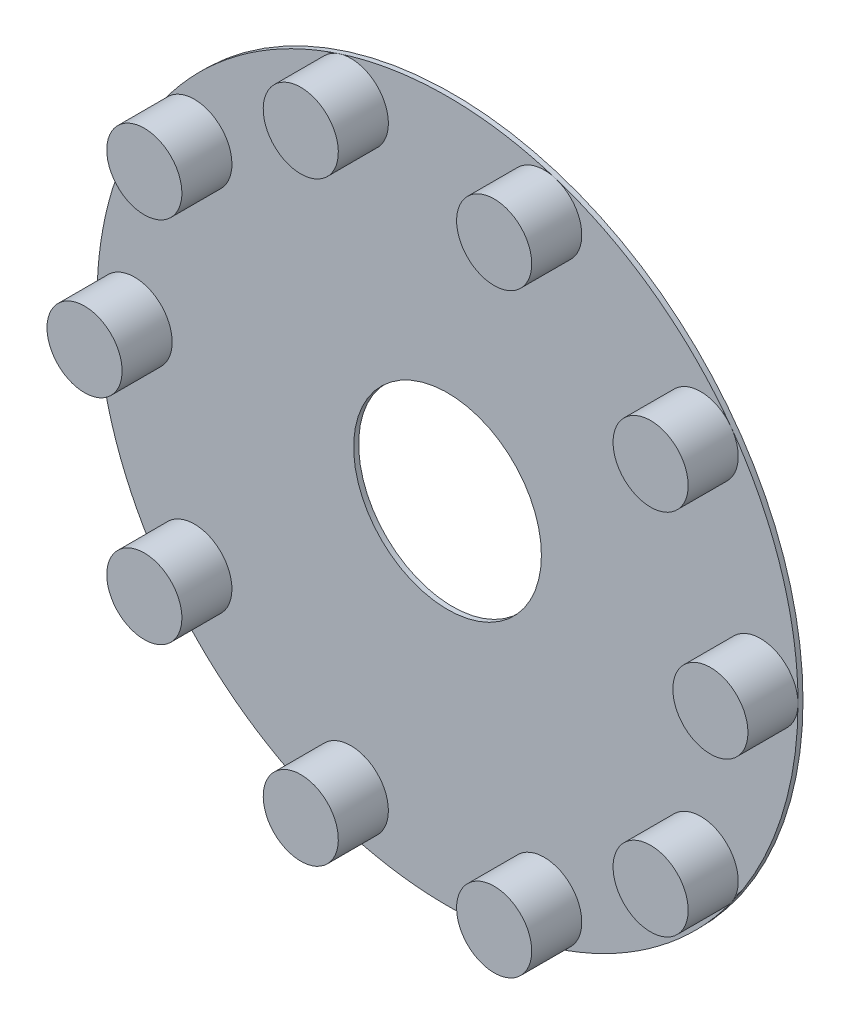
ISO-10303-21;
HEADER;
FILE_DESCRIPTION(('STEP AP214'),'2;1');
FILE_NAME('part.step','',(''),(''),'','','');
FILE_SCHEMA(('AUTOMOTIVE_DESIGN { 1 0 10303 214 1 1 1 1 }'));
ENDSEC;
DATA;
#1=APPLICATION_CONTEXT('core data for automotive mechanical design processes');
#2=APPLICATION_PROTOCOL_DEFINITION('international standard','automotive_design',2000,#1);
#3=PRODUCT_CONTEXT('',#1,'mechanical');
#4=PRODUCT('Part','Part','',(#3));
#5=PRODUCT_RELATED_PRODUCT_CATEGORY('part','',(#4));
#6=PRODUCT_DEFINITION_FORMATION('','',#4);
#7=PRODUCT_DEFINITION_CONTEXT('part definition',#1,'design');
#8=PRODUCT_DEFINITION('design','',#6,#7);
#9=PRODUCT_DEFINITION_SHAPE('','',#8);
#10=(LENGTH_UNIT() NAMED_UNIT(*) SI_UNIT(.MILLI.,.METRE.));
#11=(NAMED_UNIT(*) PLANE_ANGLE_UNIT() SI_UNIT($,.RADIAN.));
#12=(NAMED_UNIT(*) SI_UNIT($,.STERADIAN.) SOLID_ANGLE_UNIT());
#13=UNCERTAINTY_MEASURE_WITH_UNIT(LENGTH_MEASURE(1.E-05),#10,'distance_accuracy_value','');
#14=(GEOMETRIC_REPRESENTATION_CONTEXT(3) GLOBAL_UNCERTAINTY_ASSIGNED_CONTEXT((#13)) GLOBAL_UNIT_ASSIGNED_CONTEXT((#10,
#11,#12)) REPRESENTATION_CONTEXT('',''));
#15=CARTESIAN_POINT('',(0.,0.,0.));
#16=DIRECTION('',(0.,0.,1.));
#17=DIRECTION('',(1.,0.,0.));
#18=AXIS2_PLACEMENT_3D('',#15,#16,#17);
#19=CARTESIAN_POINT('',(0.,0.,-0.2));
#20=DIRECTION('',(0.,0.,1.));
#21=DIRECTION('',(1.,0.,0.));
#22=AXIS2_PLACEMENT_3D('',#19,#20,#21);
#23=CYLINDRICAL_SURFACE('',#22,28.);
#24=CARTESIAN_POINT('',(0.,0.,0.2));
#25=DIRECTION('',(0.,0.,1.));
#26=DIRECTION('',(1.,0.,0.));
#27=AXIS2_PLACEMENT_3D('',#24,#25,#26);
#28=CIRCLE('',#27,28.);
#29=CARTESIAN_POINT('',(28.,0.,0.2));
#30=VERTEX_POINT('',#29);
#31=CARTESIAN_POINT('',(22.6524758424985,16.4579870641893,0.2));
#32=VERTEX_POINT('',#31);
#33=EDGE_CURVE('E66',#30,#32,#28,.T.);
#34=ORIENTED_EDGE('',*,*,#33,.F.);
#35=CARTESIAN_POINT('',(22.6524758424985,-16.4579870641892,0.2));
#36=VERTEX_POINT('',#35);
#37=EDGE_CURVE('E62',#36,#30,#28,.T.);
#38=ORIENTED_EDGE('',*,*,#37,.F.);
#39=CARTESIAN_POINT('',(8.65247584249853,-26.6295824562643,0.2));
#40=VERTEX_POINT('',#39);
#41=EDGE_CURVE('E91',#40,#36,#28,.T.);
#42=ORIENTED_EDGE('',*,*,#41,.F.);
#43=CARTESIAN_POINT('',(-8.65247584249853,-26.6295824562643,0.2));
#44=VERTEX_POINT('',#43);
#45=EDGE_CURVE('E105',#44,#40,#28,.T.);
#46=ORIENTED_EDGE('',*,*,#45,.F.);
#47=CARTESIAN_POINT('',(-22.6524758424985,-16.4579870641893,0.2));
#48=VERTEX_POINT('',#47);
#49=EDGE_CURVE('E134',#48,#44,#28,.T.);
#50=ORIENTED_EDGE('',*,*,#49,.F.);
#51=CARTESIAN_POINT('',(-28.,0.,0.2));
#52=VERTEX_POINT('',#51);
#53=EDGE_CURVE('E129',#52,#48,#28,.T.);
#54=ORIENTED_EDGE('',*,*,#53,.F.);
#55=CARTESIAN_POINT('',(-22.6524758424985,16.4579870641892,0.2));
#56=VERTEX_POINT('',#55);
#57=EDGE_CURVE('E124',#56,#52,#28,.T.);
#58=ORIENTED_EDGE('',*,*,#57,.F.);
#59=CARTESIAN_POINT('',(-8.65247584249853,26.6295824562643,0.2));
#60=VERTEX_POINT('',#59);
#61=EDGE_CURVE('E121',#60,#56,#28,.T.);
#62=ORIENTED_EDGE('',*,*,#61,.F.);
#63=CARTESIAN_POINT('',(8.65247584249852,26.6295824562643,0.2));
#64=VERTEX_POINT('',#63);
#65=EDGE_CURVE('E120',#64,#60,#28,.T.);
#66=ORIENTED_EDGE('',*,*,#65,.F.);
#67=EDGE_CURVE('E114',#32,#64,#28,.T.);
#68=ORIENTED_EDGE('',*,*,#67,.F.);
#69=EDGE_LOOP('',(#34,#38,#42,#46,#50,#54,#58,#62,#66,#68));
#70=FACE_BOUND('',#69,.T.);
#71=CARTESIAN_POINT('',(0.,0.,-0.2));
#72=DIRECTION('',(0.,0.,1.));
#73=DIRECTION('',(1.,0.,0.));
#74=AXIS2_PLACEMENT_3D('',#71,#72,#73);
#75=CIRCLE('',#74,28.);
#76=CARTESIAN_POINT('',(28.,0.,-0.2));
#77=VERTEX_POINT('',#76);
#78=EDGE_CURVE('E53',#77,#77,#75,.T.);
#79=ORIENTED_EDGE('',*,*,#78,.T.);
#80=EDGE_LOOP('',(#79));
#81=FACE_BOUND('',#80,.T.);
#82=ADVANCED_FACE('F44',(#70,#81),#23,.T.);
#83=CARTESIAN_POINT('',(0.,0.,-0.2));
#84=DIRECTION('',(0.,0.,1.));
#85=DIRECTION('',(1.,0.,0.));
#86=AXIS2_PLACEMENT_3D('',#83,#84,#85);
#87=PLANE('',#86);
#88=CARTESIAN_POINT('',(0.,0.,-0.2));
#89=DIRECTION('',(0.,0.,1.));
#90=DIRECTION('',(1.,0.,0.));
#91=AXIS2_PLACEMENT_3D('',#88,#89,#90);
#92=CIRCLE('',#91,7.5);
#93=CARTESIAN_POINT('',(7.5,0.,-0.2));
#94=VERTEX_POINT('',#93);
#95=EDGE_CURVE('E191',#94,#94,#92,.F.);
#96=ORIENTED_EDGE('',*,*,#95,.F.);
#97=EDGE_LOOP('',(#96));
#98=FACE_BOUND('',#97,.T.);
#99=ORIENTED_EDGE('',*,*,#78,.F.);
#100=EDGE_LOOP('',(#99));
#101=FACE_BOUND('',#100,.T.);
#102=ADVANCED_FACE('F218',(#98,#101),#87,.F.);
#103=CARTESIAN_POINT('',(0.,0.,0.2));
#104=DIRECTION('',(0.,0.,1.));
#105=DIRECTION('',(1.,0.,0.));
#106=AXIS2_PLACEMENT_3D('',#103,#104,#105);
#107=PLANE('',#106);
#108=CARTESIAN_POINT('',(0.,0.,0.2));
#109=DIRECTION('',(0.,0.,1.));
#110=DIRECTION('',(1.,0.,0.));
#111=AXIS2_PLACEMENT_3D('',#108,#109,#110);
#112=CIRCLE('',#111,7.5);
#113=CARTESIAN_POINT('',(7.5,0.,0.2));
#114=VERTEX_POINT('',#113);
#115=EDGE_CURVE('E48',#114,#114,#112,.F.);
#116=ORIENTED_EDGE('',*,*,#115,.T.);
#117=EDGE_LOOP('',(#116));
#118=FACE_BOUND('',#117,.T.);
#119=ORIENTED_EDGE('',*,*,#33,.T.);
#120=CARTESIAN_POINT('',(20.2254248593737,14.6946313073118,0.2));
#121=DIRECTION('',(0.,0.,1.));
#122=DIRECTION('',(0.809016994374947,0.587785252292473,0.));
#123=AXIS2_PLACEMENT_3D('',#120,#121,#122);
#124=CIRCLE('',#123,3.);
#125=EDGE_CURVE('E190',#32,#32,#124,.T.);
#126=ORIENTED_EDGE('',*,*,#125,.F.);
#127=ORIENTED_EDGE('',*,*,#67,.T.);
#128=CARTESIAN_POINT('',(7.72542485937368,23.7764129073788,0.2));
#129=DIRECTION('',(0.,0.,1.));
#130=DIRECTION('',(0.309016994374947,0.951056516295154,0.));
#131=AXIS2_PLACEMENT_3D('',#128,#129,#130);
#132=CIRCLE('',#131,3.);
#133=EDGE_CURVE('E178',#64,#64,#132,.T.);
#134=ORIENTED_EDGE('',*,*,#133,.F.);
#135=ORIENTED_EDGE('',*,*,#65,.T.);
#136=CARTESIAN_POINT('',(-7.72542485937369,23.7764129073788,0.2));
#137=DIRECTION('',(0.,0.,1.));
#138=DIRECTION('',(-0.309016994374948,0.951056516295154,0.));
#139=AXIS2_PLACEMENT_3D('',#136,#137,#138);
#140=CIRCLE('',#139,3.);
#141=EDGE_CURVE('E172',#60,#60,#140,.T.);
#142=ORIENTED_EDGE('',*,*,#141,.F.);
#143=ORIENTED_EDGE('',*,*,#61,.T.);
#144=CARTESIAN_POINT('',(-20.2254248593737,14.6946313073118,0.2));
#145=DIRECTION('',(0.,0.,1.));
#146=DIRECTION('',(-0.809016994374948,0.587785252292473,0.));
#147=AXIS2_PLACEMENT_3D('',#144,#145,#146);
#148=CIRCLE('',#147,3.);
#149=EDGE_CURVE('E162',#56,#56,#148,.T.);
#150=ORIENTED_EDGE('',*,*,#149,.F.);
#151=ORIENTED_EDGE('',*,*,#57,.T.);
#152=CARTESIAN_POINT('',(-25.,0.,0.2));
#153=DIRECTION('',(0.,0.,1.));
#154=DIRECTION('',(-1.,0.,0.));
#155=AXIS2_PLACEMENT_3D('',#152,#153,#154);
#156=CIRCLE('',#155,3.);
#157=EDGE_CURVE('E153',#52,#52,#156,.T.);
#158=ORIENTED_EDGE('',*,*,#157,.F.);
#159=ORIENTED_EDGE('',*,*,#53,.T.);
#160=CARTESIAN_POINT('',(-20.2254248593737,-14.6946313073118,0.2));
#161=DIRECTION('',(0.,0.,1.));
#162=DIRECTION('',(-0.809016994374947,-0.587785252292473,0.));
#163=AXIS2_PLACEMENT_3D('',#160,#161,#162);
#164=CIRCLE('',#163,3.);
#165=EDGE_CURVE('E142',#48,#48,#164,.T.);
#166=ORIENTED_EDGE('',*,*,#165,.F.);
#167=ORIENTED_EDGE('',*,*,#49,.T.);
#168=CARTESIAN_POINT('',(-7.72542485937368,-23.7764129073788,0.2));
#169=DIRECTION('',(0.,0.,1.));
#170=DIRECTION('',(-0.309016994374947,-0.951056516295154,0.));
#171=AXIS2_PLACEMENT_3D('',#168,#169,#170);
#172=CIRCLE('',#171,3.);
#173=EDGE_CURVE('E139',#44,#44,#172,.T.);
#174=ORIENTED_EDGE('',*,*,#173,.F.);
#175=ORIENTED_EDGE('',*,*,#45,.T.);
#176=CARTESIAN_POINT('',(7.72542485937369,-23.7764129073788,0.2));
#177=DIRECTION('',(0.,0.,1.));
#178=DIRECTION('',(0.309016994374948,-0.951056516295154,0.));
#179=AXIS2_PLACEMENT_3D('',#176,#177,#178);
#180=CIRCLE('',#179,3.);
#181=EDGE_CURVE('E98',#40,#40,#180,.T.);
#182=ORIENTED_EDGE('',*,*,#181,.F.);
#183=ORIENTED_EDGE('',*,*,#41,.T.);
#184=CARTESIAN_POINT('',(20.2254248593737,-14.6946313073118,0.2));
#185=DIRECTION('',(0.,0.,1.));
#186=DIRECTION('',(0.809016994374947,-0.587785252292473,0.));
#187=AXIS2_PLACEMENT_3D('',#184,#185,#186);
#188=CIRCLE('',#187,3.);
#189=EDGE_CURVE('E96',#36,#36,#188,.T.);
#190=ORIENTED_EDGE('',*,*,#189,.F.);
#191=ORIENTED_EDGE('',*,*,#37,.T.);
#192=CARTESIAN_POINT('',(25.,0.,0.2));
#193=DIRECTION('',(0.,0.,1.));
#194=DIRECTION('',(1.,0.,0.));
#195=AXIS2_PLACEMENT_3D('',#192,#193,#194);
#196=CIRCLE('',#195,3.);
#197=EDGE_CURVE('E11',#30,#30,#196,.T.);
#198=ORIENTED_EDGE('',*,*,#197,.F.);
#199=EDGE_LOOP('',(#119,#126,#127,#134,#135,#142,#143,#150,#151,#158,#159,#166,#167,#174,#175,
#182,#183,#190,#191,#198));
#200=FACE_BOUND('',#199,.T.);
#201=ADVANCED_FACE('F94',(#118,#200),#107,.T.);
#202=CARTESIAN_POINT('',(25.,0.,-0.2));
#203=DIRECTION('',(0.,0.,1.));
#204=DIRECTION('',(1.,0.,0.));
#205=AXIS2_PLACEMENT_3D('',#202,#203,#204);
#206=CYLINDRICAL_SURFACE('',#205,3.);
#207=ORIENTED_EDGE('',*,*,#197,.T.);
#208=EDGE_LOOP('',(#207));
#209=FACE_BOUND('',#208,.T.);
#210=CARTESIAN_POINT('',(25.,0.,4.2));
#211=DIRECTION('',(0.,0.,1.));
#212=DIRECTION('',(1.,0.,0.));
#213=AXIS2_PLACEMENT_3D('',#210,#211,#212);
#214=CIRCLE('',#213,3.);
#215=CARTESIAN_POINT('',(28.,0.,4.2));
#216=VERTEX_POINT('',#215);
#217=EDGE_CURVE('E106',#216,#216,#214,.T.);
#218=ORIENTED_EDGE('',*,*,#217,.F.);
#219=EDGE_LOOP('',(#218));
#220=FACE_BOUND('',#219,.T.);
#221=ADVANCED_FACE('F216',(#209,#220),#206,.T.);
#222=CARTESIAN_POINT('',(25.,0.,4.2));
#223=DIRECTION('',(0.,0.,1.));
#224=DIRECTION('',(1.,0.,0.));
#225=AXIS2_PLACEMENT_3D('',#222,#223,#224);
#226=PLANE('',#225);
#227=ORIENTED_EDGE('',*,*,#217,.T.);
#228=EDGE_LOOP('',(#227));
#229=FACE_BOUND('',#228,.T.);
#230=ADVANCED_FACE('F206',(#229),#226,.T.);
#231=CARTESIAN_POINT('',(20.2254248593737,-14.6946313073118,-0.2));
#232=DIRECTION('',(0.,0.,1.));
#233=DIRECTION('',(0.809016994374947,-0.587785252292473,0.));
#234=AXIS2_PLACEMENT_3D('',#231,#232,#233);
#235=CYLINDRICAL_SURFACE('',#234,3.);
#236=ORIENTED_EDGE('',*,*,#189,.T.);
#237=EDGE_LOOP('',(#236));
#238=FACE_BOUND('',#237,.T.);
#239=CARTESIAN_POINT('',(20.2254248593737,-14.6946313073118,4.2));
#240=DIRECTION('',(0.,0.,1.));
#241=DIRECTION('',(0.809016994374947,-0.587785252292473,0.));
#242=AXIS2_PLACEMENT_3D('',#239,#240,#241);
#243=CIRCLE('',#242,3.);
#244=CARTESIAN_POINT('',(22.6524758424985,-16.4579870641892,4.2));
#245=VERTEX_POINT('',#244);
#246=EDGE_CURVE('E108',#245,#245,#243,.T.);
#247=ORIENTED_EDGE('',*,*,#246,.F.);
#248=EDGE_LOOP('',(#247));
#249=FACE_BOUND('',#248,.T.);
#250=ADVANCED_FACE('F204',(#238,#249),#235,.T.);
#251=CARTESIAN_POINT('',(20.2254248593737,-14.6946313073118,4.2));
#252=DIRECTION('',(0.,0.,1.));
#253=DIRECTION('',(0.809016994374947,-0.587785252292473,0.));
#254=AXIS2_PLACEMENT_3D('',#251,#252,#253);
#255=PLANE('',#254);
#256=ORIENTED_EDGE('',*,*,#246,.T.);
#257=EDGE_LOOP('',(#256));
#258=FACE_BOUND('',#257,.T.);
#259=ADVANCED_FACE('F205',(#258),#255,.T.);
#260=CARTESIAN_POINT('',(7.72542485937369,-23.7764129073788,-0.2));
#261=DIRECTION('',(0.,0.,1.));
#262=DIRECTION('',(0.309016994374948,-0.951056516295154,0.));
#263=AXIS2_PLACEMENT_3D('',#260,#261,#262);
#264=CYLINDRICAL_SURFACE('',#263,3.);
#265=ORIENTED_EDGE('',*,*,#181,.T.);
#266=EDGE_LOOP('',(#265));
#267=FACE_BOUND('',#266,.T.);
#268=CARTESIAN_POINT('',(7.72542485937369,-23.7764129073788,4.2));
#269=DIRECTION('',(0.,0.,1.));
#270=DIRECTION('',(0.309016994374948,-0.951056516295154,0.));
#271=AXIS2_PLACEMENT_3D('',#268,#269,#270);
#272=CIRCLE('',#271,3.);
#273=CARTESIAN_POINT('',(8.65247584249853,-26.6295824562643,4.2));
#274=VERTEX_POINT('',#273);
#275=EDGE_CURVE('E197',#274,#274,#272,.T.);
#276=ORIENTED_EDGE('',*,*,#275,.F.);
#277=EDGE_LOOP('',(#276));
#278=FACE_BOUND('',#277,.T.);
#279=ADVANCED_FACE('F213',(#267,#278),#264,.T.);
#280=CARTESIAN_POINT('',(7.72542485937369,-23.7764129073788,4.2));
#281=DIRECTION('',(0.,0.,1.));
#282=DIRECTION('',(0.309016994374948,-0.951056516295154,0.));
#283=AXIS2_PLACEMENT_3D('',#280,#281,#282);
#284=PLANE('',#283);
#285=ORIENTED_EDGE('',*,*,#275,.T.);
#286=EDGE_LOOP('',(#285));
#287=FACE_BOUND('',#286,.T.);
#288=ADVANCED_FACE('F268',(#287),#284,.T.);
#289=CARTESIAN_POINT('',(-7.72542485937368,-23.7764129073788,-0.2));
#290=DIRECTION('',(0.,0.,1.));
#291=DIRECTION('',(-0.309016994374947,-0.951056516295154,0.));
#292=AXIS2_PLACEMENT_3D('',#289,#290,#291);
#293=CYLINDRICAL_SURFACE('',#292,3.);
#294=ORIENTED_EDGE('',*,*,#173,.T.);
#295=EDGE_LOOP('',(#294));
#296=FACE_BOUND('',#295,.T.);
#297=CARTESIAN_POINT('',(-7.72542485937368,-23.7764129073788,4.2));
#298=DIRECTION('',(0.,0.,1.));
#299=DIRECTION('',(-0.309016994374947,-0.951056516295154,0.));
#300=AXIS2_PLACEMENT_3D('',#297,#298,#299);
#301=CIRCLE('',#300,3.);
#302=CARTESIAN_POINT('',(-8.65247584249853,-26.6295824562643,4.2));
#303=VERTEX_POINT('',#302);
#304=EDGE_CURVE('E156',#303,#303,#301,.T.);
#305=ORIENTED_EDGE('',*,*,#304,.F.);
#306=EDGE_LOOP('',(#305));
#307=FACE_BOUND('',#306,.T.);
#308=ADVANCED_FACE('F279',(#296,#307),#293,.T.);
#309=CARTESIAN_POINT('',(-7.72542485937368,-23.7764129073788,4.2));
#310=DIRECTION('',(0.,0.,1.));
#311=DIRECTION('',(-0.309016994374947,-0.951056516295154,0.));
#312=AXIS2_PLACEMENT_3D('',#309,#310,#311);
#313=PLANE('',#312);
#314=ORIENTED_EDGE('',*,*,#304,.T.);
#315=EDGE_LOOP('',(#314));
#316=FACE_BOUND('',#315,.T.);
#317=ADVANCED_FACE('F287',(#316),#313,.T.);
#318=CARTESIAN_POINT('',(-20.2254248593737,-14.6946313073118,-0.2));
#319=DIRECTION('',(0.,0.,1.));
#320=DIRECTION('',(-0.809016994374947,-0.587785252292473,0.));
#321=AXIS2_PLACEMENT_3D('',#318,#319,#320);
#322=CYLINDRICAL_SURFACE('',#321,3.);
#323=ORIENTED_EDGE('',*,*,#165,.T.);
#324=EDGE_LOOP('',(#323));
#325=FACE_BOUND('',#324,.T.);
#326=CARTESIAN_POINT('',(-20.2254248593737,-14.6946313073118,4.2));
#327=DIRECTION('',(0.,0.,1.));
#328=DIRECTION('',(-0.809016994374947,-0.587785252292473,0.));
#329=AXIS2_PLACEMENT_3D('',#326,#327,#328);
#330=CIRCLE('',#329,3.);
#331=CARTESIAN_POINT('',(-22.6524758424985,-16.4579870641893,4.2));
#332=VERTEX_POINT('',#331);
#333=EDGE_CURVE('E144',#332,#332,#330,.T.);
#334=ORIENTED_EDGE('',*,*,#333,.F.);
#335=EDGE_LOOP('',(#334));
#336=FACE_BOUND('',#335,.T.);
#337=ADVANCED_FACE('F299',(#325,#336),#322,.T.);
#338=CARTESIAN_POINT('',(-20.2254248593737,-14.6946313073118,4.2));
#339=DIRECTION('',(0.,0.,1.));
#340=DIRECTION('',(-0.809016994374947,-0.587785252292473,0.));
#341=AXIS2_PLACEMENT_3D('',#338,#339,#340);
#342=PLANE('',#341);
#343=ORIENTED_EDGE('',*,*,#333,.T.);
#344=EDGE_LOOP('',(#343));
#345=FACE_BOUND('',#344,.T.);
#346=ADVANCED_FACE('F306',(#345),#342,.T.);
#347=CARTESIAN_POINT('',(-25.,0.,-0.2));
#348=DIRECTION('',(0.,0.,1.));
#349=DIRECTION('',(-1.,0.,0.));
#350=AXIS2_PLACEMENT_3D('',#347,#348,#349);
#351=CYLINDRICAL_SURFACE('',#350,3.);
#352=ORIENTED_EDGE('',*,*,#157,.T.);
#353=EDGE_LOOP('',(#352));
#354=FACE_BOUND('',#353,.T.);
#355=CARTESIAN_POINT('',(-25.,0.,4.2));
#356=DIRECTION('',(0.,0.,1.));
#357=DIRECTION('',(-1.,0.,0.));
#358=AXIS2_PLACEMENT_3D('',#355,#356,#357);
#359=CIRCLE('',#358,3.);
#360=CARTESIAN_POINT('',(-28.,0.,4.2));
#361=VERTEX_POINT('',#360);
#362=EDGE_CURVE('E148',#361,#361,#359,.T.);
#363=ORIENTED_EDGE('',*,*,#362,.F.);
#364=EDGE_LOOP('',(#363));
#365=FACE_BOUND('',#364,.T.);
#366=ADVANCED_FACE('F320',(#354,#365),#351,.T.);
#367=CARTESIAN_POINT('',(-25.,0.,4.2));
#368=DIRECTION('',(0.,0.,1.));
#369=DIRECTION('',(-1.,0.,0.));
#370=AXIS2_PLACEMENT_3D('',#367,#368,#369);
#371=PLANE('',#370);
#372=ORIENTED_EDGE('',*,*,#362,.T.);
#373=EDGE_LOOP('',(#372));
#374=FACE_BOUND('',#373,.T.);
#375=ADVANCED_FACE('F330',(#374),#371,.T.);
#376=CARTESIAN_POINT('',(-20.2254248593737,14.6946313073118,-0.2));
#377=DIRECTION('',(0.,0.,1.));
#378=DIRECTION('',(-0.809016994374948,0.587785252292473,0.));
#379=AXIS2_PLACEMENT_3D('',#376,#377,#378);
#380=CYLINDRICAL_SURFACE('',#379,3.);
#381=ORIENTED_EDGE('',*,*,#149,.T.);
#382=EDGE_LOOP('',(#381));
#383=FACE_BOUND('',#382,.T.);
#384=CARTESIAN_POINT('',(-20.2254248593737,14.6946313073118,4.2));
#385=DIRECTION('',(0.,0.,1.));
#386=DIRECTION('',(-0.809016994374948,0.587785252292473,0.));
#387=AXIS2_PLACEMENT_3D('',#384,#385,#386);
#388=CIRCLE('',#387,3.);
#389=CARTESIAN_POINT('',(-22.6524758424985,16.4579870641892,4.2));
#390=VERTEX_POINT('',#389);
#391=EDGE_CURVE('E161',#390,#390,#388,.T.);
#392=ORIENTED_EDGE('',*,*,#391,.F.);
#393=EDGE_LOOP('',(#392));
#394=FACE_BOUND('',#393,.T.);
#395=ADVANCED_FACE('F340',(#383,#394),#380,.T.);
#396=CARTESIAN_POINT('',(-20.2254248593737,14.6946313073118,4.2));
#397=DIRECTION('',(0.,0.,1.));
#398=DIRECTION('',(-0.809016994374948,0.587785252292473,0.));
#399=AXIS2_PLACEMENT_3D('',#396,#397,#398);
#400=PLANE('',#399);
#401=ORIENTED_EDGE('',*,*,#391,.T.);
#402=EDGE_LOOP('',(#401));
#403=FACE_BOUND('',#402,.T.);
#404=ADVANCED_FACE('F350',(#403),#400,.T.);
#405=CARTESIAN_POINT('',(-7.72542485937369,23.7764129073788,-0.2));
#406=DIRECTION('',(0.,0.,1.));
#407=DIRECTION('',(-0.309016994374948,0.951056516295154,0.));
#408=AXIS2_PLACEMENT_3D('',#405,#406,#407);
#409=CYLINDRICAL_SURFACE('',#408,3.);
#410=ORIENTED_EDGE('',*,*,#141,.T.);
#411=EDGE_LOOP('',(#410));
#412=FACE_BOUND('',#411,.T.);
#413=CARTESIAN_POINT('',(-7.72542485937369,23.7764129073788,4.2));
#414=DIRECTION('',(0.,0.,1.));
#415=DIRECTION('',(-0.309016994374948,0.951056516295154,0.));
#416=AXIS2_PLACEMENT_3D('',#413,#414,#415);
#417=CIRCLE('',#416,3.);
#418=CARTESIAN_POINT('',(-8.65247584249853,26.6295824562643,4.2));
#419=VERTEX_POINT('',#418);
#420=EDGE_CURVE('E170',#419,#419,#417,.T.);
#421=ORIENTED_EDGE('',*,*,#420,.F.);
#422=EDGE_LOOP('',(#421));
#423=FACE_BOUND('',#422,.T.);
#424=ADVANCED_FACE('F360',(#412,#423),#409,.T.);
#425=CARTESIAN_POINT('',(-7.72542485937369,23.7764129073788,4.2));
#426=DIRECTION('',(0.,0.,1.));
#427=DIRECTION('',(-0.309016994374948,0.951056516295154,0.));
#428=AXIS2_PLACEMENT_3D('',#425,#426,#427);
#429=PLANE('',#428);
#430=ORIENTED_EDGE('',*,*,#420,.T.);
#431=EDGE_LOOP('',(#430));
#432=FACE_BOUND('',#431,.T.);
#433=ADVANCED_FACE('F370',(#432),#429,.T.);
#434=CARTESIAN_POINT('',(7.72542485937368,23.7764129073788,-0.2));
#435=DIRECTION('',(0.,0.,1.));
#436=DIRECTION('',(0.309016994374947,0.951056516295154,0.));
#437=AXIS2_PLACEMENT_3D('',#434,#435,#436);
#438=CYLINDRICAL_SURFACE('',#437,3.);
#439=ORIENTED_EDGE('',*,*,#133,.T.);
#440=EDGE_LOOP('',(#439));
#441=FACE_BOUND('',#440,.T.);
#442=CARTESIAN_POINT('',(7.72542485937368,23.7764129073788,4.2));
#443=DIRECTION('',(0.,0.,1.));
#444=DIRECTION('',(0.309016994374947,0.951056516295154,0.));
#445=AXIS2_PLACEMENT_3D('',#442,#443,#444);
#446=CIRCLE('',#445,3.);
#447=CARTESIAN_POINT('',(8.65247584249852,26.6295824562643,4.2));
#448=VERTEX_POINT('',#447);
#449=EDGE_CURVE('E173',#448,#448,#446,.T.);
#450=ORIENTED_EDGE('',*,*,#449,.F.);
#451=EDGE_LOOP('',(#450));
#452=FACE_BOUND('',#451,.T.);
#453=ADVANCED_FACE('F380',(#441,#452),#438,.T.);
#454=CARTESIAN_POINT('',(7.72542485937368,23.7764129073788,4.2));
#455=DIRECTION('',(0.,0.,1.));
#456=DIRECTION('',(0.309016994374947,0.951056516295154,0.));
#457=AXIS2_PLACEMENT_3D('',#454,#455,#456);
#458=PLANE('',#457);
#459=ORIENTED_EDGE('',*,*,#449,.T.);
#460=EDGE_LOOP('',(#459));
#461=FACE_BOUND('',#460,.T.);
#462=ADVANCED_FACE('F390',(#461),#458,.T.);
#463=CARTESIAN_POINT('',(20.2254248593737,14.6946313073118,-0.2));
#464=DIRECTION('',(0.,0.,1.));
#465=DIRECTION('',(0.809016994374947,0.587785252292473,0.));
#466=AXIS2_PLACEMENT_3D('',#463,#464,#465);
#467=CYLINDRICAL_SURFACE('',#466,3.);
#468=ORIENTED_EDGE('',*,*,#125,.T.);
#469=EDGE_LOOP('',(#468));
#470=FACE_BOUND('',#469,.T.);
#471=CARTESIAN_POINT('',(20.2254248593737,14.6946313073118,4.2));
#472=DIRECTION('',(0.,0.,1.));
#473=DIRECTION('',(0.809016994374947,0.587785252292473,0.));
#474=AXIS2_PLACEMENT_3D('',#471,#472,#473);
#475=CIRCLE('',#474,3.);
#476=CARTESIAN_POINT('',(22.6524758424985,16.4579870641893,4.2));
#477=VERTEX_POINT('',#476);
#478=EDGE_CURVE('E181',#477,#477,#475,.T.);
#479=ORIENTED_EDGE('',*,*,#478,.F.);
#480=EDGE_LOOP('',(#479));
#481=FACE_BOUND('',#480,.T.);
#482=ADVANCED_FACE('F400',(#470,#481),#467,.T.);
#483=CARTESIAN_POINT('',(20.2254248593737,14.6946313073118,4.2));
#484=DIRECTION('',(0.,0.,1.));
#485=DIRECTION('',(0.809016994374947,0.587785252292473,0.));
#486=AXIS2_PLACEMENT_3D('',#483,#484,#485);
#487=PLANE('',#486);
#488=ORIENTED_EDGE('',*,*,#478,.T.);
#489=EDGE_LOOP('',(#488));
#490=FACE_BOUND('',#489,.T.);
#491=ADVANCED_FACE('F407',(#490),#487,.T.);
#492=CARTESIAN_POINT('',(0.,0.,0.));
#493=DIRECTION('',(0.,0.,1.));
#494=DIRECTION('',(1.,0.,0.));
#495=AXIS2_PLACEMENT_3D('',#492,#493,#494);
#496=CYLINDRICAL_SURFACE('',#495,7.5);
#497=ORIENTED_EDGE('',*,*,#115,.F.);
#498=EDGE_LOOP('',(#497));
#499=FACE_BOUND('',#498,.T.);
#500=ORIENTED_EDGE('',*,*,#95,.T.);
#501=EDGE_LOOP('',(#500));
#502=FACE_BOUND('',#501,.T.);
#503=ADVANCED_FACE('F413',(#499,#502),#496,.F.);
#504=CLOSED_SHELL('',(#82,#102,#201,#221,#230,#250,#259,#279,#288,#308,#317,#337,#346,#366,#375,
#395,#404,#424,#433,#453,#462,#482,#491,#503));
#505=MANIFOLD_SOLID_BREP('B2',#504);
#506=ADVANCED_BREP_SHAPE_REPRESENTATION('',(#18,#505),#14);
#507=SHAPE_DEFINITION_REPRESENTATION(#9,#506);
ENDSEC;
END-ISO-10303-21;
